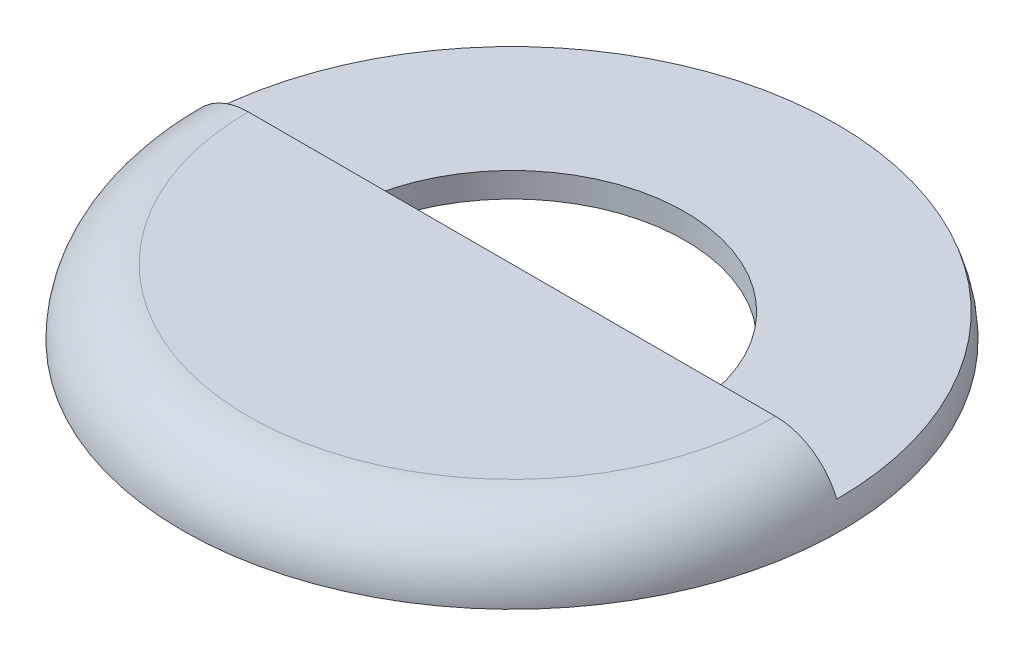
ISO-10303-21;
HEADER;
FILE_DESCRIPTION(('STEP AP214'),'2;1');
FILE_NAME('part.step','',(''),(''),'','','');
FILE_SCHEMA(('AUTOMOTIVE_DESIGN { 1 0 10303 214 1 1 1 1 }'));
ENDSEC;
DATA;
#1=APPLICATION_CONTEXT('core data for automotive mechanical design processes');
#2=APPLICATION_PROTOCOL_DEFINITION('international standard','automotive_design',2000,#1);
#3=PRODUCT_CONTEXT('',#1,'mechanical');
#4=PRODUCT('Part','Part','',(#3));
#5=PRODUCT_RELATED_PRODUCT_CATEGORY('part','',(#4));
#6=PRODUCT_DEFINITION_FORMATION('','',#4);
#7=PRODUCT_DEFINITION_CONTEXT('part definition',#1,'design');
#8=PRODUCT_DEFINITION('design','',#6,#7);
#9=PRODUCT_DEFINITION_SHAPE('','',#8);
#10=(LENGTH_UNIT() NAMED_UNIT(*) SI_UNIT(.MILLI.,.METRE.));
#11=(NAMED_UNIT(*) PLANE_ANGLE_UNIT() SI_UNIT($,.RADIAN.));
#12=(NAMED_UNIT(*) SI_UNIT($,.STERADIAN.) SOLID_ANGLE_UNIT());
#13=UNCERTAINTY_MEASURE_WITH_UNIT(LENGTH_MEASURE(1.E-05),#10,'distance_accuracy_value','');
#14=(GEOMETRIC_REPRESENTATION_CONTEXT(3) GLOBAL_UNCERTAINTY_ASSIGNED_CONTEXT((#13)) GLOBAL_UNIT_ASSIGNED_CONTEXT((#10,
#11,#12)) REPRESENTATION_CONTEXT('',''));
#15=CARTESIAN_POINT('',(0.,0.,0.));
#16=DIRECTION('',(0.,0.,1.));
#17=DIRECTION('',(1.,0.,0.));
#18=AXIS2_PLACEMENT_3D('',#15,#16,#17);
#19=CARTESIAN_POINT('',(42.6551184533123,55.4278760968653,19.890408394288));
#20=DIRECTION('',(0.,1.,0.));
#21=DIRECTION('',(0.,0.,1.));
#22=AXIS2_PLACEMENT_3D('',#19,#20,#21);
#23=PLANE('',#22);
#24=CARTESIAN_POINT('',(0.,55.4278760968653,0.));
#25=DIRECTION('',(0.,-1.,0.));
#26=DIRECTION('',(0.,0.,-1.));
#27=AXIS2_PLACEMENT_3D('',#24,#25,#26);
#28=CIRCLE('',#27,40.);
#29=CARTESIAN_POINT('',(0.,55.4278760968653,-40.));
#30=VERTEX_POINT('',#29);
#31=EDGE_CURVE('E136',#30,#30,#28,.T.);
#32=ORIENTED_EDGE('',*,*,#31,.T.);
#33=EDGE_LOOP('',(#32));
#34=FACE_BOUND('',#33,.T.);
#35=DIRECTION('',(-1.,0.,0.));
#36=VECTOR('',#35,1.);
#37=CARTESIAN_POINT('',(21.,55.4278760968653,0.));
#38=LINE('',#37,#36);
#39=CARTESIAN_POINT('',(21.,55.4278760968653,0.));
#40=VERTEX_POINT('',#39);
#41=CARTESIAN_POINT('',(-21.,55.4278760968653,0.));
#42=VERTEX_POINT('',#41);
#43=EDGE_CURVE('E83',#40,#42,#38,.T.);
#44=ORIENTED_EDGE('',*,*,#43,.F.);
#45=CARTESIAN_POINT('',(0.,55.4278760968653,0.));
#46=DIRECTION('',(0.,1.,0.));
#47=DIRECTION('',(0.,0.,1.));
#48=AXIS2_PLACEMENT_3D('',#45,#46,#47);
#49=CIRCLE('',#48,21.);
#50=EDGE_CURVE('E12',#42,#40,#49,.F.);
#51=ORIENTED_EDGE('',*,*,#50,.F.);
#52=EDGE_LOOP('',(#44,#51));
#53=FACE_BOUND('',#52,.T.);
#54=ADVANCED_FACE('F74',(#34,#53),#23,.F.);
#55=CARTESIAN_POINT('',(0.,63.4278760968653,0.));
#56=DIRECTION('',(0.,1.,0.));
#57=DIRECTION('',(0.,0.,1.));
#58=AXIS2_PLACEMENT_3D('',#55,#56,#57);
#59=PLANE('',#58);
#60=DIRECTION('',(1.,0.,0.));
#61=VECTOR('',#60,1.);
#62=CARTESIAN_POINT('',(0.,63.4278760968653,0.));
#63=LINE('',#62,#61);
#64=CARTESIAN_POINT('',(-32.,63.4278760968653,2.51386656396706E-13));
#65=VERTEX_POINT('',#64);
#66=CARTESIAN_POINT('',(32.,63.4278760968653,0.));
#67=VERTEX_POINT('',#66);
#68=EDGE_CURVE('E112',#65,#67,#63,.T.);
#69=ORIENTED_EDGE('',*,*,#68,.F.);
#70=CARTESIAN_POINT('',(0.,63.4278760968653,0.));
#71=DIRECTION('',(0.,-1.,0.));
#72=DIRECTION('',(0.,0.,-1.));
#73=AXIS2_PLACEMENT_3D('',#70,#71,#72);
#74=CIRCLE('',#73,32.);
#75=EDGE_CURVE('E115',#67,#65,#74,.T.);
#76=ORIENTED_EDGE('',*,*,#75,.F.);
#77=EDGE_LOOP('',(#69,#76));
#78=FACE_BOUND('',#77,.T.);
#79=ADVANCED_FACE('F76',(#78),#59,.T.);
#80=CARTESIAN_POINT('',(0.,55.4278760968653,0.));
#81=DIRECTION('',(0.,-1.,0.));
#82=DIRECTION('',(0.,0.,-1.));
#83=AXIS2_PLACEMENT_3D('',#80,#81,#82);
#84=TOROIDAL_SURFACE('',#83,32.,8.);
#85=CARTESIAN_POINT('',(-32.,55.4278760968653,1.1172740284298E-13));
#86=DIRECTION('',(0.,0.,1.));
#87=DIRECTION('',(1.,0.,0.));
#88=AXIS2_PLACEMENT_3D('',#85,#86,#87);
#89=CIRCLE('',#88,8.);
#90=CARTESIAN_POINT('',(-39.4161984870957,58.4278760968653,2.77280175019557E-13));
#91=VERTEX_POINT('',#90);
#92=EDGE_CURVE('E122',#91,#65,#89,.F.);
#93=ORIENTED_EDGE('',*,*,#92,.F.);
#94=CARTESIAN_POINT('',(0.,58.4278760968653,0.));
#95=DIRECTION('',(0.,-1.,0.));
#96=DIRECTION('',(0.,0.,-1.));
#97=AXIS2_PLACEMENT_3D('',#94,#95,#96);
#98=CIRCLE('',#97,39.4161984870957);
#99=CARTESIAN_POINT('',(39.4161984870957,58.4278760968653,0.));
#100=VERTEX_POINT('',#99);
#101=EDGE_CURVE('E154',#100,#91,#98,.F.);
#102=ORIENTED_EDGE('',*,*,#101,.F.);
#103=CARTESIAN_POINT('',(32.,55.4278760968653,-1.1172740284298E-13));
#104=DIRECTION('',(0.,0.,1.));
#105=DIRECTION('',(1.,0.,0.));
#106=AXIS2_PLACEMENT_3D('',#103,#104,#105);
#107=CIRCLE('',#106,8.);
#108=EDGE_CURVE('E131',#67,#100,#107,.F.);
#109=ORIENTED_EDGE('',*,*,#108,.F.);
#110=ORIENTED_EDGE('',*,*,#75,.T.);
#111=EDGE_LOOP('',(#93,#102,#109,#110));
#112=FACE_BOUND('',#111,.T.);
#113=ORIENTED_EDGE('',*,*,#31,.F.);
#114=EDGE_LOOP('',(#113));
#115=FACE_BOUND('',#114,.T.);
#116=ADVANCED_FACE('F133',(#112,#115),#84,.T.);
#117=CARTESIAN_POINT('',(0.,73.,0.));
#118=DIRECTION('',(0.,-1.,0.));
#119=DIRECTION('',(0.,0.,-1.));
#120=AXIS2_PLACEMENT_3D('',#117,#118,#119);
#121=CYLINDRICAL_SURFACE('',#120,21.);
#122=DIRECTION('',(0.,-1.,0.));
#123=VECTOR('',#122,1.);
#124=CARTESIAN_POINT('',(-21.,73.,0.));
#125=LINE('',#124,#123);
#126=CARTESIAN_POINT('',(-21.,58.4278760968654,0.));
#127=VERTEX_POINT('',#126);
#128=EDGE_CURVE('E140',#127,#42,#125,.T.);
#129=ORIENTED_EDGE('',*,*,#128,.T.);
#130=ORIENTED_EDGE('',*,*,#50,.T.);
#131=DIRECTION('',(0.,-1.,0.));
#132=VECTOR('',#131,1.);
#133=CARTESIAN_POINT('',(21.,73.,0.));
#134=LINE('',#133,#132);
#135=CARTESIAN_POINT('',(21.,58.4278760968653,0.));
#136=VERTEX_POINT('',#135);
#137=EDGE_CURVE('E130',#136,#40,#134,.T.);
#138=ORIENTED_EDGE('',*,*,#137,.F.);
#139=CARTESIAN_POINT('',(0.,58.4278760968653,0.));
#140=DIRECTION('',(0.,-1.,0.));
#141=DIRECTION('',(0.,0.,-1.));
#142=AXIS2_PLACEMENT_3D('',#139,#140,#141);
#143=CIRCLE('',#142,21.);
#144=EDGE_CURVE('E147',#136,#127,#143,.F.);
#145=ORIENTED_EDGE('',*,*,#144,.T.);
#146=EDGE_LOOP('',(#129,#130,#138,#145));
#147=FACE_BOUND('',#146,.T.);
#148=ADVANCED_FACE('F146',(#147),#121,.F.);
#149=CARTESIAN_POINT('',(21.,73.,0.));
#150=DIRECTION('',(0.,0.,1.));
#151=DIRECTION('',(1.,0.,0.));
#152=AXIS2_PLACEMENT_3D('',#149,#150,#151);
#153=PLANE('',#152);
#154=ORIENTED_EDGE('',*,*,#137,.T.);
#155=ORIENTED_EDGE('',*,*,#43,.T.);
#156=ORIENTED_EDGE('',*,*,#128,.F.);
#157=DIRECTION('',(1.,0.,0.));
#158=VECTOR('',#157,1.);
#159=CARTESIAN_POINT('',(-40.,58.4278760968653,2.79318507107451E-13));
#160=LINE('',#159,#158);
#161=EDGE_CURVE('E126',#91,#127,#160,.T.);
#162=ORIENTED_EDGE('',*,*,#161,.F.);
#163=ORIENTED_EDGE('',*,*,#92,.T.);
#164=ORIENTED_EDGE('',*,*,#68,.T.);
#165=ORIENTED_EDGE('',*,*,#108,.T.);
#166=EDGE_CURVE('E159',#136,#100,#160,.T.);
#167=ORIENTED_EDGE('',*,*,#166,.F.);
#168=EDGE_LOOP('',(#154,#155,#156,#162,#163,#164,#165,#167));
#169=FACE_BOUND('',#168,.T.);
#170=ADVANCED_FACE('F124',(#169),#153,.F.);
#171=CARTESIAN_POINT('',(0.,58.4278760968653,0.));
#172=DIRECTION('',(0.,-1.,0.));
#173=DIRECTION('',(0.,0.,-1.));
#174=AXIS2_PLACEMENT_3D('',#171,#172,#173);
#175=PLANE('',#174);
#176=ORIENTED_EDGE('',*,*,#101,.T.);
#177=ORIENTED_EDGE('',*,*,#161,.T.);
#178=ORIENTED_EDGE('',*,*,#144,.F.);
#179=ORIENTED_EDGE('',*,*,#166,.T.);
#180=EDGE_LOOP('',(#176,#177,#178,#179));
#181=FACE_BOUND('',#180,.T.);
#182=ADVANCED_FACE('F164',(#181),#175,.F.);
#183=CLOSED_SHELL('',(#54,#79,#116,#148,#170,#182));
#184=MANIFOLD_SOLID_BREP('B2',#183);
#185=ADVANCED_BREP_SHAPE_REPRESENTATION('',(#18,#184),#14);
#186=SHAPE_DEFINITION_REPRESENTATION(#9,#185);
ENDSEC;
END-ISO-10303-21;
